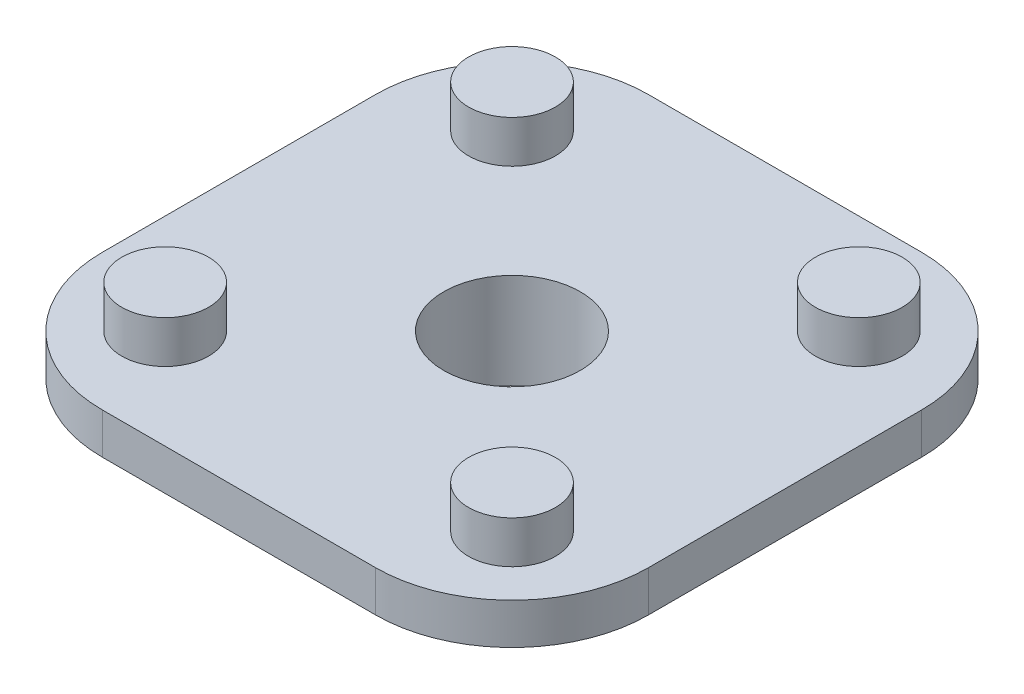
ISO-10303-21;
HEADER;
FILE_DESCRIPTION(('STEP AP214'),'2;1');
FILE_NAME('part.step','',(''),(''),'','','');
FILE_SCHEMA(('AUTOMOTIVE_DESIGN { 1 0 10303 214 1 1 1 1 }'));
ENDSEC;
DATA;
#1=APPLICATION_CONTEXT('core data for automotive mechanical design processes');
#2=APPLICATION_PROTOCOL_DEFINITION('international standard','automotive_design',2000,#1);
#3=PRODUCT_CONTEXT('',#1,'mechanical');
#4=PRODUCT('Part','Part','',(#3));
#5=PRODUCT_RELATED_PRODUCT_CATEGORY('part','',(#4));
#6=PRODUCT_DEFINITION_FORMATION('','',#4);
#7=PRODUCT_DEFINITION_CONTEXT('part definition',#1,'design');
#8=PRODUCT_DEFINITION('design','',#6,#7);
#9=PRODUCT_DEFINITION_SHAPE('','',#8);
#10=(LENGTH_UNIT() NAMED_UNIT(*) SI_UNIT(.MILLI.,.METRE.));
#11=(NAMED_UNIT(*) PLANE_ANGLE_UNIT() SI_UNIT($,.RADIAN.));
#12=(NAMED_UNIT(*) SI_UNIT($,.STERADIAN.) SOLID_ANGLE_UNIT());
#13=UNCERTAINTY_MEASURE_WITH_UNIT(LENGTH_MEASURE(1.E-05),#10,'distance_accuracy_value','');
#14=(GEOMETRIC_REPRESENTATION_CONTEXT(3) GLOBAL_UNCERTAINTY_ASSIGNED_CONTEXT((#13)) GLOBAL_UNIT_ASSIGNED_CONTEXT((#10,
#11,#12)) REPRESENTATION_CONTEXT('',''));
#15=CARTESIAN_POINT('',(0.,0.,0.));
#16=DIRECTION('',(0.,0.,1.));
#17=DIRECTION('',(1.,0.,0.));
#18=AXIS2_PLACEMENT_3D('',#15,#16,#17);
#19=CARTESIAN_POINT('',(-10.,0.,10.));
#20=DIRECTION('',(0.,1.,0.));
#21=DIRECTION('',(0.,0.,1.));
#22=AXIS2_PLACEMENT_3D('',#19,#20,#21);
#23=PLANE('',#22);
#24=CARTESIAN_POINT('',(-10.,0.,10.));
#25=DIRECTION('',(0.,1.,0.));
#26=DIRECTION('',(0.,0.,1.));
#27=AXIS2_PLACEMENT_3D('',#24,#25,#26);
#28=CIRCLE('',#27,10.);
#29=CARTESIAN_POINT('',(-20.,0.,9.99999999999993));
#30=VERTEX_POINT('',#29);
#31=CARTESIAN_POINT('',(-9.99999999999993,0.,20.));
#32=VERTEX_POINT('',#31);
#33=EDGE_CURVE('E146',#30,#32,#28,.T.);
#34=ORIENTED_EDGE('',*,*,#33,.F.);
#35=DIRECTION('',(0.,0.,1.));
#36=VECTOR('',#35,1.);
#37=CARTESIAN_POINT('',(-20.,0.,-9.99999999999993));
#38=LINE('',#37,#36);
#39=CARTESIAN_POINT('',(-20.,0.,-9.99999999999993));
#40=VERTEX_POINT('',#39);
#41=EDGE_CURVE('E96',#40,#30,#38,.T.);
#42=ORIENTED_EDGE('',*,*,#41,.F.);
#43=CARTESIAN_POINT('',(-10.,0.,-10.));
#44=DIRECTION('',(0.,1.,0.));
#45=DIRECTION('',(0.,0.,1.));
#46=AXIS2_PLACEMENT_3D('',#43,#44,#45);
#47=CIRCLE('',#46,10.);
#48=CARTESIAN_POINT('',(-9.99999999999993,0.,-20.));
#49=VERTEX_POINT('',#48);
#50=EDGE_CURVE('E90',#49,#40,#47,.T.);
#51=ORIENTED_EDGE('',*,*,#50,.F.);
#52=DIRECTION('',(-1.,0.,0.));
#53=VECTOR('',#52,1.);
#54=CARTESIAN_POINT('',(-9.99999999999993,0.,-20.));
#55=LINE('',#54,#53);
#56=CARTESIAN_POINT('',(9.99999999999993,0.,-20.));
#57=VERTEX_POINT('',#56);
#58=EDGE_CURVE('E133',#57,#49,#55,.T.);
#59=ORIENTED_EDGE('',*,*,#58,.F.);
#60=CARTESIAN_POINT('',(10.,0.,-10.));
#61=DIRECTION('',(0.,1.,0.));
#62=DIRECTION('',(0.,0.,-1.));
#63=AXIS2_PLACEMENT_3D('',#60,#61,#62);
#64=CIRCLE('',#63,10.);
#65=CARTESIAN_POINT('',(20.,0.,-9.99999999999993));
#66=VERTEX_POINT('',#65);
#67=EDGE_CURVE('E160',#66,#57,#64,.T.);
#68=ORIENTED_EDGE('',*,*,#67,.F.);
#69=DIRECTION('',(0.,0.,-1.));
#70=VECTOR('',#69,1.);
#71=CARTESIAN_POINT('',(20.,0.,-9.99999999999993));
#72=LINE('',#71,#70);
#73=CARTESIAN_POINT('',(20.,0.,9.99999999999993));
#74=VERTEX_POINT('',#73);
#75=EDGE_CURVE('E157',#74,#66,#72,.T.);
#76=ORIENTED_EDGE('',*,*,#75,.F.);
#77=CARTESIAN_POINT('',(10.,0.,10.));
#78=DIRECTION('',(0.,1.,0.));
#79=DIRECTION('',(0.,0.,1.));
#80=AXIS2_PLACEMENT_3D('',#77,#78,#79);
#81=CIRCLE('',#80,10.);
#82=CARTESIAN_POINT('',(9.99999999999993,0.,20.));
#83=VERTEX_POINT('',#82);
#84=EDGE_CURVE('E154',#83,#74,#81,.T.);
#85=ORIENTED_EDGE('',*,*,#84,.F.);
#86=DIRECTION('',(1.,0.,0.));
#87=VECTOR('',#86,1.);
#88=CARTESIAN_POINT('',(-9.99999999999993,0.,20.));
#89=LINE('',#88,#87);
#90=EDGE_CURVE('E150',#32,#83,#89,.T.);
#91=ORIENTED_EDGE('',*,*,#90,.F.);
#92=EDGE_LOOP('',(#34,#42,#51,#59,#68,#76,#85,#91));
#93=FACE_BOUND('',#92,.T.);
#94=CARTESIAN_POINT('',(0.,0.,0.));
#95=DIRECTION('',(0.,1.,0.));
#96=DIRECTION('',(0.,0.,1.));
#97=AXIS2_PLACEMENT_3D('',#94,#95,#96);
#98=CIRCLE('',#97,7.5);
#99=CARTESIAN_POINT('',(0.,0.,7.5));
#100=VERTEX_POINT('',#99);
#101=EDGE_CURVE('E11',#100,#100,#98,.F.);
#102=ORIENTED_EDGE('',*,*,#101,.F.);
#103=EDGE_LOOP('',(#102));
#104=FACE_BOUND('',#103,.T.);
#105=ADVANCED_FACE('F43',(#93,#104),#23,.F.);
#106=CARTESIAN_POINT('',(-10.,3.,10.));
#107=DIRECTION('',(0.,-1.,0.));
#108=DIRECTION('',(0.,0.,-1.));
#109=AXIS2_PLACEMENT_3D('',#106,#107,#108);
#110=CYLINDRICAL_SURFACE('',#109,10.);
#111=ORIENTED_EDGE('',*,*,#33,.T.);
#112=DIRECTION('',(0.,-1.,0.));
#113=VECTOR('',#112,1.);
#114=CARTESIAN_POINT('',(-9.99999999999993,3.,20.));
#115=LINE('',#114,#113);
#116=CARTESIAN_POINT('',(-9.99999999999993,3.,20.));
#117=VERTEX_POINT('',#116);
#118=EDGE_CURVE('E53',#117,#32,#115,.T.);
#119=ORIENTED_EDGE('',*,*,#118,.F.);
#120=CARTESIAN_POINT('',(-10.,3.,10.));
#121=DIRECTION('',(0.,1.,0.));
#122=DIRECTION('',(0.,0.,1.));
#123=AXIS2_PLACEMENT_3D('',#120,#121,#122);
#124=CIRCLE('',#123,10.);
#125=CARTESIAN_POINT('',(-20.,3.,9.99999999999993));
#126=VERTEX_POINT('',#125);
#127=EDGE_CURVE('E169',#126,#117,#124,.T.);
#128=ORIENTED_EDGE('',*,*,#127,.F.);
#129=DIRECTION('',(0.,-1.,0.));
#130=VECTOR('',#129,1.);
#131=CARTESIAN_POINT('',(-20.,3.,9.99999999999993));
#132=LINE('',#131,#130);
#133=EDGE_CURVE('E142',#126,#30,#132,.T.);
#134=ORIENTED_EDGE('',*,*,#133,.T.);
#135=EDGE_LOOP('',(#111,#119,#128,#134));
#136=FACE_BOUND('',#135,.T.);
#137=ADVANCED_FACE('F45',(#136),#110,.T.);
#138=CARTESIAN_POINT('',(-9.99999999999993,3.,20.));
#139=DIRECTION('',(0.,0.,-1.));
#140=DIRECTION('',(-1.,0.,0.));
#141=AXIS2_PLACEMENT_3D('',#138,#139,#140);
#142=PLANE('',#141);
#143=ORIENTED_EDGE('',*,*,#90,.T.);
#144=DIRECTION('',(0.,-1.,0.));
#145=VECTOR('',#144,1.);
#146=CARTESIAN_POINT('',(9.99999999999993,3.,20.));
#147=LINE('',#146,#145);
#148=CARTESIAN_POINT('',(9.99999999999993,3.,20.));
#149=VERTEX_POINT('',#148);
#150=EDGE_CURVE('E184',#149,#83,#147,.T.);
#151=ORIENTED_EDGE('',*,*,#150,.F.);
#152=DIRECTION('',(1.,0.,0.));
#153=VECTOR('',#152,1.);
#154=CARTESIAN_POINT('',(-9.99999999999993,3.,20.));
#155=LINE('',#154,#153);
#156=EDGE_CURVE('E105',#117,#149,#155,.T.);
#157=ORIENTED_EDGE('',*,*,#156,.F.);
#158=ORIENTED_EDGE('',*,*,#118,.T.);
#159=EDGE_LOOP('',(#143,#151,#157,#158));
#160=FACE_BOUND('',#159,.T.);
#161=ADVANCED_FACE('F189',(#160),#142,.F.);
#162=CARTESIAN_POINT('',(10.,3.,10.));
#163=DIRECTION('',(0.,-1.,0.));
#164=DIRECTION('',(0.,0.,-1.));
#165=AXIS2_PLACEMENT_3D('',#162,#163,#164);
#166=CYLINDRICAL_SURFACE('',#165,10.);
#167=ORIENTED_EDGE('',*,*,#84,.T.);
#168=DIRECTION('',(0.,-1.,0.));
#169=VECTOR('',#168,1.);
#170=CARTESIAN_POINT('',(20.,3.,9.99999999999993));
#171=LINE('',#170,#169);
#172=CARTESIAN_POINT('',(20.,3.,9.99999999999993));
#173=VERTEX_POINT('',#172);
#174=EDGE_CURVE('E180',#173,#74,#171,.T.);
#175=ORIENTED_EDGE('',*,*,#174,.F.);
#176=CARTESIAN_POINT('',(10.,3.,10.));
#177=DIRECTION('',(0.,1.,0.));
#178=DIRECTION('',(0.,0.,1.));
#179=AXIS2_PLACEMENT_3D('',#176,#177,#178);
#180=CIRCLE('',#179,10.);
#181=EDGE_CURVE('E208',#149,#173,#180,.T.);
#182=ORIENTED_EDGE('',*,*,#181,.F.);
#183=ORIENTED_EDGE('',*,*,#150,.T.);
#184=EDGE_LOOP('',(#167,#175,#182,#183));
#185=FACE_BOUND('',#184,.T.);
#186=ADVANCED_FACE('F200',(#185),#166,.T.);
#187=CARTESIAN_POINT('',(20.,3.,-9.99999999999993));
#188=DIRECTION('',(-1.,0.,0.));
#189=DIRECTION('',(0.,0.,1.));
#190=AXIS2_PLACEMENT_3D('',#187,#188,#189);
#191=PLANE('',#190);
#192=ORIENTED_EDGE('',*,*,#75,.T.);
#193=DIRECTION('',(0.,-1.,0.));
#194=VECTOR('',#193,1.);
#195=CARTESIAN_POINT('',(20.,3.,-9.99999999999993));
#196=LINE('',#195,#194);
#197=CARTESIAN_POINT('',(20.,3.,-9.99999999999993));
#198=VERTEX_POINT('',#197);
#199=EDGE_CURVE('E176',#198,#66,#196,.T.);
#200=ORIENTED_EDGE('',*,*,#199,.F.);
#201=DIRECTION('',(0.,0.,-1.));
#202=VECTOR('',#201,1.);
#203=CARTESIAN_POINT('',(20.,3.,-9.99999999999993));
#204=LINE('',#203,#202);
#205=EDGE_CURVE('E206',#173,#198,#204,.T.);
#206=ORIENTED_EDGE('',*,*,#205,.F.);
#207=ORIENTED_EDGE('',*,*,#174,.T.);
#208=EDGE_LOOP('',(#192,#200,#206,#207));
#209=FACE_BOUND('',#208,.T.);
#210=ADVANCED_FACE('F204',(#209),#191,.F.);
#211=CARTESIAN_POINT('',(10.,3.,-10.));
#212=DIRECTION('',(0.,-1.,0.));
#213=DIRECTION('',(0.,0.,-1.));
#214=AXIS2_PLACEMENT_3D('',#211,#212,#213);
#215=CYLINDRICAL_SURFACE('',#214,10.);
#216=ORIENTED_EDGE('',*,*,#67,.T.);
#217=DIRECTION('',(0.,-1.,0.));
#218=VECTOR('',#217,1.);
#219=CARTESIAN_POINT('',(9.99999999999993,3.,-20.));
#220=LINE('',#219,#218);
#221=CARTESIAN_POINT('',(9.99999999999993,3.,-20.));
#222=VERTEX_POINT('',#221);
#223=EDGE_CURVE('E135',#222,#57,#220,.T.);
#224=ORIENTED_EDGE('',*,*,#223,.F.);
#225=CARTESIAN_POINT('',(10.,3.,-10.));
#226=DIRECTION('',(0.,1.,0.));
#227=DIRECTION('',(0.,0.,-1.));
#228=AXIS2_PLACEMENT_3D('',#225,#226,#227);
#229=CIRCLE('',#228,10.);
#230=EDGE_CURVE('E124',#198,#222,#229,.T.);
#231=ORIENTED_EDGE('',*,*,#230,.F.);
#232=ORIENTED_EDGE('',*,*,#199,.T.);
#233=EDGE_LOOP('',(#216,#224,#231,#232));
#234=FACE_BOUND('',#233,.T.);
#235=ADVANCED_FACE('F293',(#234),#215,.T.);
#236=CARTESIAN_POINT('',(-9.99999999999993,3.,-20.));
#237=DIRECTION('',(0.,0.,1.));
#238=DIRECTION('',(1.,0.,0.));
#239=AXIS2_PLACEMENT_3D('',#236,#237,#238);
#240=PLANE('',#239);
#241=ORIENTED_EDGE('',*,*,#58,.T.);
#242=DIRECTION('',(0.,-1.,0.));
#243=VECTOR('',#242,1.);
#244=CARTESIAN_POINT('',(-9.99999999999993,3.,-20.));
#245=LINE('',#244,#243);
#246=CARTESIAN_POINT('',(-9.99999999999993,3.,-20.));
#247=VERTEX_POINT('',#246);
#248=EDGE_CURVE('E130',#247,#49,#245,.T.);
#249=ORIENTED_EDGE('',*,*,#248,.F.);
#250=DIRECTION('',(-1.,0.,0.));
#251=VECTOR('',#250,1.);
#252=CARTESIAN_POINT('',(-9.99999999999993,3.,-20.));
#253=LINE('',#252,#251);
#254=EDGE_CURVE('E118',#222,#247,#253,.T.);
#255=ORIENTED_EDGE('',*,*,#254,.F.);
#256=ORIENTED_EDGE('',*,*,#223,.T.);
#257=EDGE_LOOP('',(#241,#249,#255,#256));
#258=FACE_BOUND('',#257,.T.);
#259=ADVANCED_FACE('F131',(#258),#240,.F.);
#260=CARTESIAN_POINT('',(-10.,3.,-10.));
#261=DIRECTION('',(0.,-1.,0.));
#262=DIRECTION('',(0.,0.,-1.));
#263=AXIS2_PLACEMENT_3D('',#260,#261,#262);
#264=CYLINDRICAL_SURFACE('',#263,10.);
#265=ORIENTED_EDGE('',*,*,#50,.T.);
#266=DIRECTION('',(0.,-1.,0.));
#267=VECTOR('',#266,1.);
#268=CARTESIAN_POINT('',(-20.,3.,-9.99999999999993));
#269=LINE('',#268,#267);
#270=CARTESIAN_POINT('',(-20.,3.,-9.99999999999993));
#271=VERTEX_POINT('',#270);
#272=EDGE_CURVE('E136',#271,#40,#269,.T.);
#273=ORIENTED_EDGE('',*,*,#272,.F.);
#274=CARTESIAN_POINT('',(-10.,3.,-10.));
#275=DIRECTION('',(0.,1.,0.));
#276=DIRECTION('',(0.,0.,1.));
#277=AXIS2_PLACEMENT_3D('',#274,#275,#276);
#278=CIRCLE('',#277,10.);
#279=EDGE_CURVE('E122',#247,#271,#278,.T.);
#280=ORIENTED_EDGE('',*,*,#279,.F.);
#281=ORIENTED_EDGE('',*,*,#248,.T.);
#282=EDGE_LOOP('',(#265,#273,#280,#281));
#283=FACE_BOUND('',#282,.T.);
#284=ADVANCED_FACE('F138',(#283),#264,.T.);
#285=CARTESIAN_POINT('',(-20.,3.,-9.99999999999993));
#286=DIRECTION('',(1.,0.,0.));
#287=DIRECTION('',(0.,0.,-1.));
#288=AXIS2_PLACEMENT_3D('',#285,#286,#287);
#289=PLANE('',#288);
#290=ORIENTED_EDGE('',*,*,#41,.T.);
#291=ORIENTED_EDGE('',*,*,#133,.F.);
#292=DIRECTION('',(0.,0.,1.));
#293=VECTOR('',#292,1.);
#294=CARTESIAN_POINT('',(-20.,3.,-9.99999999999993));
#295=LINE('',#294,#293);
#296=EDGE_CURVE('E61',#271,#126,#295,.T.);
#297=ORIENTED_EDGE('',*,*,#296,.F.);
#298=ORIENTED_EDGE('',*,*,#272,.T.);
#299=EDGE_LOOP('',(#290,#291,#297,#298));
#300=FACE_BOUND('',#299,.T.);
#301=ADVANCED_FACE('F286',(#300),#289,.F.);
#302=CARTESIAN_POINT('',(-10.,3.,10.));
#303=DIRECTION('',(0.,1.,0.));
#304=DIRECTION('',(0.,0.,1.));
#305=AXIS2_PLACEMENT_3D('',#302,#303,#304);
#306=PLANE('',#305);
#307=CARTESIAN_POINT('',(0.,3.,0.));
#308=DIRECTION('',(0.,1.,0.));
#309=DIRECTION('',(0.,0.,1.));
#310=AXIS2_PLACEMENT_3D('',#307,#308,#309);
#311=CIRCLE('',#310,5.);
#312=CARTESIAN_POINT('',(0.,3.,5.));
#313=VERTEX_POINT('',#312);
#314=EDGE_CURVE('E246',#313,#313,#311,.T.);
#315=ORIENTED_EDGE('',*,*,#314,.F.);
#316=EDGE_LOOP('',(#315));
#317=FACE_BOUND('',#316,.T.);
#318=CARTESIAN_POINT('',(-12.7,3.,-12.7));
#319=DIRECTION('',(0.,1.,0.));
#320=DIRECTION('',(0.,0.,-1.));
#321=AXIS2_PLACEMENT_3D('',#318,#319,#320);
#322=CIRCLE('',#321,3.18);
#323=CARTESIAN_POINT('',(-12.7,3.,-15.88));
#324=VERTEX_POINT('',#323);
#325=EDGE_CURVE('E238',#324,#324,#322,.T.);
#326=ORIENTED_EDGE('',*,*,#325,.F.);
#327=EDGE_LOOP('',(#326));
#328=FACE_BOUND('',#327,.T.);
#329=CARTESIAN_POINT('',(-12.7,3.,12.7));
#330=DIRECTION('',(0.,1.,0.));
#331=DIRECTION('',(0.,0.,1.));
#332=AXIS2_PLACEMENT_3D('',#329,#330,#331);
#333=CIRCLE('',#332,3.18);
#334=CARTESIAN_POINT('',(-12.7,3.,9.52));
#335=VERTEX_POINT('',#334);
#336=EDGE_CURVE('E230',#335,#335,#333,.T.);
#337=ORIENTED_EDGE('',*,*,#336,.F.);
#338=EDGE_LOOP('',(#337));
#339=FACE_BOUND('',#338,.T.);
#340=CARTESIAN_POINT('',(12.7,3.,12.7));
#341=DIRECTION('',(0.,1.,0.));
#342=DIRECTION('',(0.,0.,-1.));
#343=AXIS2_PLACEMENT_3D('',#340,#341,#342);
#344=CIRCLE('',#343,3.18);
#345=CARTESIAN_POINT('',(12.7,3.,9.52));
#346=VERTEX_POINT('',#345);
#347=EDGE_CURVE('E222',#346,#346,#344,.T.);
#348=ORIENTED_EDGE('',*,*,#347,.F.);
#349=EDGE_LOOP('',(#348));
#350=FACE_BOUND('',#349,.T.);
#351=CARTESIAN_POINT('',(12.7,3.,-12.7));
#352=DIRECTION('',(0.,1.,0.));
#353=DIRECTION('',(0.,0.,1.));
#354=AXIS2_PLACEMENT_3D('',#351,#352,#353);
#355=CIRCLE('',#354,3.18);
#356=CARTESIAN_POINT('',(12.7,3.,-15.88));
#357=VERTEX_POINT('',#356);
#358=EDGE_CURVE('E218',#357,#357,#355,.T.);
#359=ORIENTED_EDGE('',*,*,#358,.F.);
#360=EDGE_LOOP('',(#359));
#361=FACE_BOUND('',#360,.T.);
#362=ORIENTED_EDGE('',*,*,#127,.T.);
#363=ORIENTED_EDGE('',*,*,#156,.T.);
#364=ORIENTED_EDGE('',*,*,#181,.T.);
#365=ORIENTED_EDGE('',*,*,#205,.T.);
#366=ORIENTED_EDGE('',*,*,#230,.T.);
#367=ORIENTED_EDGE('',*,*,#254,.T.);
#368=ORIENTED_EDGE('',*,*,#279,.T.);
#369=ORIENTED_EDGE('',*,*,#296,.T.);
#370=EDGE_LOOP('',(#362,#363,#364,#365,#366,#367,#368,#369));
#371=FACE_BOUND('',#370,.T.);
#372=ADVANCED_FACE('F120',(#317,#328,#339,#350,#361,#371),#306,.T.);
#373=CARTESIAN_POINT('',(12.7,6.1,-12.7));
#374=DIRECTION('',(0.,-1.,0.));
#375=DIRECTION('',(0.,0.,-1.));
#376=AXIS2_PLACEMENT_3D('',#373,#374,#375);
#377=CYLINDRICAL_SURFACE('',#376,3.18);
#378=CARTESIAN_POINT('',(12.7,6.1,-12.7));
#379=DIRECTION('',(0.,1.,0.));
#380=DIRECTION('',(0.,0.,1.));
#381=AXIS2_PLACEMENT_3D('',#378,#379,#380);
#382=CIRCLE('',#381,3.18);
#383=CARTESIAN_POINT('',(12.7,6.1,-15.88));
#384=VERTEX_POINT('',#383);
#385=EDGE_CURVE('E151',#384,#384,#382,.T.);
#386=CARTESIAN_POINT('',(12.7,6.1,-15.88));
#387=CARTESIAN_POINT('',(12.7,6.06770833333333,-15.88));
#388=CARTESIAN_POINT('',(12.7,6.03541666666667,-15.88));
#389=CARTESIAN_POINT('',(12.7,5.97083333333333,-15.88));
#390=CARTESIAN_POINT('',(12.7,5.93854166666667,-15.88));
#391=CARTESIAN_POINT('',(12.7,5.87395833333333,-15.88));
#392=CARTESIAN_POINT('',(12.7,5.84166666666667,-15.88));
#393=CARTESIAN_POINT('',(12.7,5.77708333333333,-15.88));
#394=CARTESIAN_POINT('',(12.7,5.74479166666667,-15.88));
#395=CARTESIAN_POINT('',(12.7,5.68020833333333,-15.88));
#396=CARTESIAN_POINT('',(12.7,5.64791666666667,-15.88));
#397=CARTESIAN_POINT('',(12.7,5.58333333333333,-15.88));
#398=CARTESIAN_POINT('',(12.7,5.55104166666667,-15.88));
#399=CARTESIAN_POINT('',(12.7,5.48645833333333,-15.88));
#400=CARTESIAN_POINT('',(12.7,5.45416666666667,-15.88));
#401=CARTESIAN_POINT('',(12.7,5.38958333333333,-15.88));
#402=CARTESIAN_POINT('',(12.7,5.35729166666667,-15.88));
#403=CARTESIAN_POINT('',(12.7,5.29270833333333,-15.88));
#404=CARTESIAN_POINT('',(12.7,5.26041666666667,-15.88));
#405=CARTESIAN_POINT('',(12.7,5.19583333333333,-15.88));
#406=CARTESIAN_POINT('',(12.7,5.16354166666667,-15.88));
#407=CARTESIAN_POINT('',(12.7,5.09895833333333,-15.88));
#408=CARTESIAN_POINT('',(12.7,5.06666666666667,-15.88));
#409=CARTESIAN_POINT('',(12.7,5.00208333333333,-15.88));
#410=CARTESIAN_POINT('',(12.7,4.96979166666667,-15.88));
#411=CARTESIAN_POINT('',(12.7,4.90520833333333,-15.88));
#412=CARTESIAN_POINT('',(12.7,4.87291666666667,-15.88));
#413=CARTESIAN_POINT('',(12.7,4.80833333333333,-15.88));
#414=CARTESIAN_POINT('',(12.7,4.77604166666667,-15.88));
#415=CARTESIAN_POINT('',(12.7,4.71145833333333,-15.88));
#416=CARTESIAN_POINT('',(12.7,4.67916666666667,-15.88));
#417=CARTESIAN_POINT('',(12.7,4.61458333333333,-15.88));
#418=CARTESIAN_POINT('',(12.7,4.58229166666667,-15.88));
#419=CARTESIAN_POINT('',(12.7,4.51770833333333,-15.88));
#420=CARTESIAN_POINT('',(12.7,4.48541666666667,-15.88));
#421=CARTESIAN_POINT('',(12.7,4.42083333333333,-15.88));
#422=CARTESIAN_POINT('',(12.7,4.38854166666667,-15.88));
#423=CARTESIAN_POINT('',(12.7,4.32395833333333,-15.88));
#424=CARTESIAN_POINT('',(12.7,4.29166666666667,-15.88));
#425=CARTESIAN_POINT('',(12.7,4.22708333333333,-15.88));
#426=CARTESIAN_POINT('',(12.7,4.19479166666667,-15.88));
#427=CARTESIAN_POINT('',(12.7,4.13020833333333,-15.88));
#428=CARTESIAN_POINT('',(12.7,4.09791666666667,-15.88));
#429=CARTESIAN_POINT('',(12.7,4.03333333333333,-15.88));
#430=CARTESIAN_POINT('',(12.7,4.00104166666667,-15.88));
#431=CARTESIAN_POINT('',(12.7,3.93645833333333,-15.88));
#432=CARTESIAN_POINT('',(12.7,3.90416666666667,-15.88));
#433=CARTESIAN_POINT('',(12.7,3.83958333333333,-15.88));
#434=CARTESIAN_POINT('',(12.7,3.80729166666667,-15.88));
#435=CARTESIAN_POINT('',(12.7,3.74270833333333,-15.88));
#436=CARTESIAN_POINT('',(12.7,3.71041666666667,-15.88));
#437=CARTESIAN_POINT('',(12.7,3.64583333333333,-15.88));
#438=CARTESIAN_POINT('',(12.7,3.61354166666667,-15.88));
#439=CARTESIAN_POINT('',(12.7,3.54895833333333,-15.88));
#440=CARTESIAN_POINT('',(12.7,3.51666666666667,-15.88));
#441=CARTESIAN_POINT('',(12.7,3.45208333333333,-15.88));
#442=CARTESIAN_POINT('',(12.7,3.41979166666667,-15.88));
#443=CARTESIAN_POINT('',(12.7,3.35520833333333,-15.88));
#444=CARTESIAN_POINT('',(12.7,3.32291666666667,-15.88));
#445=CARTESIAN_POINT('',(12.7,3.25833333333333,-15.88));
#446=CARTESIAN_POINT('',(12.7,3.22604166666667,-15.88));
#447=CARTESIAN_POINT('',(12.7,3.16145833333333,-15.88));
#448=CARTESIAN_POINT('',(12.7,3.12916666666667,-15.88));
#449=CARTESIAN_POINT('',(12.7,3.06458333333333,-15.88));
#450=CARTESIAN_POINT('',(12.7,3.03229166666667,-15.88));
#451=CARTESIAN_POINT('',(12.7,3.,-15.88));
#452=B_SPLINE_CURVE_WITH_KNOTS('',3,(#386,#387,#388,#389,#390,#391,#392,#393,#394,#395,#396,
#397,#398,#399,#400,#401,#402,#403,#404,#405,#406,#407,#408,#409,#410,#411,#412,#413,#414,#415,
#416,#417,#418,#419,#420,#421,#422,#423,#424,#425,#426,#427,#428,#429,#430,#431,#432,#433,#434,
#435,#436,#437,#438,#439,#440,#441,#442,#443,#444,#445,#446,#447,#448,#449,#450,#451),
.UNSPECIFIED.,.F.,.F.,(4,2,2,2,2,2,2,2,2,2,2,2,2,2,2,2,2,2,2,2,2,2,2,2,2,2,2,2,2,2,2,2,4),(0.,
0.0968750000000006,0.19375,0.290625,0.387500000000001,0.484375,0.58125,0.678125,0.775,0.871875,
0.96875,1.065625,1.1625,1.259375,1.35625,1.453125,1.55,1.646875,1.74375,1.840625,1.9375,
2.034375,2.13125,2.228125,2.325,2.421875,2.51875,2.615625,2.7125,2.809375,2.90625,3.003125,3.1),.UNSPECIFIED.);
#453=EDGE_CURVE('BSEAM336',#384,#357,#452,.T.);
#454=ORIENTED_EDGE('',*,*,#385,.F.);
#455=ORIENTED_EDGE('',*,*,#358,.T.);
#456=ORIENTED_EDGE('',*,*,#453,.T.);
#457=ORIENTED_EDGE('',*,*,#453,.F.);
#458=EDGE_LOOP('',(#454,#456,#455,#457));
#459=FACE_BOUND('',#458,.T.);
#460=ADVANCED_FACE('F336',(#459),#377,.T.);
#461=CARTESIAN_POINT('',(12.7,6.1,-12.7));
#462=DIRECTION('',(0.,1.,0.));
#463=DIRECTION('',(0.,0.,1.));
#464=AXIS2_PLACEMENT_3D('',#461,#462,#463);
#465=PLANE('',#464);
#466=ORIENTED_EDGE('',*,*,#385,.T.);
#467=EDGE_LOOP('',(#466));
#468=FACE_BOUND('',#467,.T.);
#469=ADVANCED_FACE('F343',(#468),#465,.T.);
#470=CARTESIAN_POINT('',(12.7,6.1,12.7));
#471=DIRECTION('',(0.,-1.,0.));
#472=DIRECTION('',(0.,0.,-1.));
#473=AXIS2_PLACEMENT_3D('',#470,#471,#472);
#474=CYLINDRICAL_SURFACE('',#473,3.18);
#475=CARTESIAN_POINT('',(12.7,6.1,12.7));
#476=DIRECTION('',(0.,1.,0.));
#477=DIRECTION('',(0.,0.,-1.));
#478=AXIS2_PLACEMENT_3D('',#475,#476,#477);
#479=CIRCLE('',#478,3.18);
#480=CARTESIAN_POINT('',(12.7,6.1,9.52));
#481=VERTEX_POINT('',#480);
#482=EDGE_CURVE('E226',#481,#481,#479,.T.);
#483=CARTESIAN_POINT('',(12.7,6.1,9.52));
#484=CARTESIAN_POINT('',(12.7,6.06770833333333,9.52));
#485=CARTESIAN_POINT('',(12.7,6.03541666666667,9.52));
#486=CARTESIAN_POINT('',(12.7,5.97083333333333,9.52));
#487=CARTESIAN_POINT('',(12.7,5.93854166666667,9.52));
#488=CARTESIAN_POINT('',(12.7,5.87395833333333,9.52));
#489=CARTESIAN_POINT('',(12.7,5.84166666666667,9.52));
#490=CARTESIAN_POINT('',(12.7,5.77708333333333,9.52));
#491=CARTESIAN_POINT('',(12.7,5.74479166666667,9.52));
#492=CARTESIAN_POINT('',(12.7,5.68020833333333,9.52));
#493=CARTESIAN_POINT('',(12.7,5.64791666666667,9.52));
#494=CARTESIAN_POINT('',(12.7,5.58333333333333,9.52));
#495=CARTESIAN_POINT('',(12.7,5.55104166666667,9.52));
#496=CARTESIAN_POINT('',(12.7,5.48645833333333,9.52));
#497=CARTESIAN_POINT('',(12.7,5.45416666666667,9.52));
#498=CARTESIAN_POINT('',(12.7,5.38958333333333,9.52));
#499=CARTESIAN_POINT('',(12.7,5.35729166666667,9.52));
#500=CARTESIAN_POINT('',(12.7,5.29270833333333,9.52));
#501=CARTESIAN_POINT('',(12.7,5.26041666666667,9.52));
#502=CARTESIAN_POINT('',(12.7,5.19583333333333,9.52));
#503=CARTESIAN_POINT('',(12.7,5.16354166666667,9.52));
#504=CARTESIAN_POINT('',(12.7,5.09895833333333,9.52));
#505=CARTESIAN_POINT('',(12.7,5.06666666666667,9.52));
#506=CARTESIAN_POINT('',(12.7,5.00208333333333,9.52));
#507=CARTESIAN_POINT('',(12.7,4.96979166666667,9.52));
#508=CARTESIAN_POINT('',(12.7,4.90520833333333,9.52));
#509=CARTESIAN_POINT('',(12.7,4.87291666666667,9.52));
#510=CARTESIAN_POINT('',(12.7,4.80833333333333,9.52));
#511=CARTESIAN_POINT('',(12.7,4.77604166666667,9.52));
#512=CARTESIAN_POINT('',(12.7,4.71145833333333,9.52));
#513=CARTESIAN_POINT('',(12.7,4.67916666666667,9.52));
#514=CARTESIAN_POINT('',(12.7,4.61458333333333,9.52));
#515=CARTESIAN_POINT('',(12.7,4.58229166666667,9.52));
#516=CARTESIAN_POINT('',(12.7,4.51770833333333,9.52));
#517=CARTESIAN_POINT('',(12.7,4.48541666666667,9.52));
#518=CARTESIAN_POINT('',(12.7,4.42083333333333,9.52));
#519=CARTESIAN_POINT('',(12.7,4.38854166666667,9.52));
#520=CARTESIAN_POINT('',(12.7,4.32395833333333,9.52));
#521=CARTESIAN_POINT('',(12.7,4.29166666666667,9.52));
#522=CARTESIAN_POINT('',(12.7,4.22708333333333,9.52));
#523=CARTESIAN_POINT('',(12.7,4.19479166666667,9.52));
#524=CARTESIAN_POINT('',(12.7,4.13020833333333,9.52));
#525=CARTESIAN_POINT('',(12.7,4.09791666666667,9.52));
#526=CARTESIAN_POINT('',(12.7,4.03333333333333,9.52));
#527=CARTESIAN_POINT('',(12.7,4.00104166666667,9.52));
#528=CARTESIAN_POINT('',(12.7,3.93645833333333,9.52));
#529=CARTESIAN_POINT('',(12.7,3.90416666666667,9.52));
#530=CARTESIAN_POINT('',(12.7,3.83958333333333,9.52));
#531=CARTESIAN_POINT('',(12.7,3.80729166666667,9.52));
#532=CARTESIAN_POINT('',(12.7,3.74270833333333,9.52));
#533=CARTESIAN_POINT('',(12.7,3.71041666666667,9.52));
#534=CARTESIAN_POINT('',(12.7,3.64583333333333,9.52));
#535=CARTESIAN_POINT('',(12.7,3.61354166666667,9.52));
#536=CARTESIAN_POINT('',(12.7,3.54895833333333,9.52));
#537=CARTESIAN_POINT('',(12.7,3.51666666666667,9.52));
#538=CARTESIAN_POINT('',(12.7,3.45208333333333,9.52));
#539=CARTESIAN_POINT('',(12.7,3.41979166666667,9.52));
#540=CARTESIAN_POINT('',(12.7,3.35520833333333,9.52));
#541=CARTESIAN_POINT('',(12.7,3.32291666666667,9.52));
#542=CARTESIAN_POINT('',(12.7,3.25833333333333,9.52));
#543=CARTESIAN_POINT('',(12.7,3.22604166666667,9.52));
#544=CARTESIAN_POINT('',(12.7,3.16145833333333,9.52));
#545=CARTESIAN_POINT('',(12.7,3.12916666666667,9.52));
#546=CARTESIAN_POINT('',(12.7,3.06458333333333,9.52));
#547=CARTESIAN_POINT('',(12.7,3.03229166666667,9.52));
#548=CARTESIAN_POINT('',(12.7,3.,9.52));
#549=B_SPLINE_CURVE_WITH_KNOTS('',3,(#483,#484,#485,#486,#487,#488,#489,#490,#491,#492,#493,
#494,#495,#496,#497,#498,#499,#500,#501,#502,#503,#504,#505,#506,#507,#508,#509,#510,#511,#512,
#513,#514,#515,#516,#517,#518,#519,#520,#521,#522,#523,#524,#525,#526,#527,#528,#529,#530,#531,
#532,#533,#534,#535,#536,#537,#538,#539,#540,#541,#542,#543,#544,#545,#546,#547,#548),
.UNSPECIFIED.,.F.,.F.,(4,2,2,2,2,2,2,2,2,2,2,2,2,2,2,2,2,2,2,2,2,2,2,2,2,2,2,2,2,2,2,2,4),(0.,
0.0968750000000006,0.19375,0.290625,0.387500000000001,0.484375,0.58125,0.678125,0.775,0.871875,
0.96875,1.065625,1.1625,1.259375,1.35625,1.453125,1.55,1.646875,1.74375,1.840625,1.9375,
2.034375,2.13125,2.228125,2.325,2.421875,2.51875,2.615625,2.7125,2.809375,2.90625,3.003125,3.1),.UNSPECIFIED.);
#550=EDGE_CURVE('BSEAM350',#481,#346,#549,.T.);
#551=ORIENTED_EDGE('',*,*,#482,.F.);
#552=ORIENTED_EDGE('',*,*,#347,.T.);
#553=ORIENTED_EDGE('',*,*,#550,.T.);
#554=ORIENTED_EDGE('',*,*,#550,.F.);
#555=EDGE_LOOP('',(#551,#553,#552,#554));
#556=FACE_BOUND('',#555,.T.);
#557=ADVANCED_FACE('F350',(#556),#474,.T.);
#558=CARTESIAN_POINT('',(12.7,6.1,12.7));
#559=DIRECTION('',(0.,-1.,0.));
#560=DIRECTION('',(0.,0.,-1.));
#561=AXIS2_PLACEMENT_3D('',#558,#559,#560);
#562=PLANE('',#561);
#563=ORIENTED_EDGE('',*,*,#482,.T.);
#564=EDGE_LOOP('',(#563));
#565=FACE_BOUND('',#564,.T.);
#566=ADVANCED_FACE('F358',(#565),#562,.F.);
#567=CARTESIAN_POINT('',(-12.7,6.1,12.7));
#568=DIRECTION('',(0.,-1.,0.));
#569=DIRECTION('',(0.,0.,-1.));
#570=AXIS2_PLACEMENT_3D('',#567,#568,#569);
#571=CYLINDRICAL_SURFACE('',#570,3.18);
#572=CARTESIAN_POINT('',(-12.7,6.1,12.7));
#573=DIRECTION('',(0.,1.,0.));
#574=DIRECTION('',(0.,0.,1.));
#575=AXIS2_PLACEMENT_3D('',#572,#573,#574);
#576=CIRCLE('',#575,3.18);
#577=CARTESIAN_POINT('',(-12.7,6.1,9.52));
#578=VERTEX_POINT('',#577);
#579=EDGE_CURVE('E234',#578,#578,#576,.T.);
#580=CARTESIAN_POINT('',(-12.7,6.1,9.52));
#581=CARTESIAN_POINT('',(-12.7,6.06770833333333,9.52));
#582=CARTESIAN_POINT('',(-12.7,6.03541666666667,9.52));
#583=CARTESIAN_POINT('',(-12.7,5.97083333333333,9.52));
#584=CARTESIAN_POINT('',(-12.7,5.93854166666667,9.52));
#585=CARTESIAN_POINT('',(-12.7,5.87395833333333,9.52));
#586=CARTESIAN_POINT('',(-12.7,5.84166666666667,9.52));
#587=CARTESIAN_POINT('',(-12.7,5.77708333333333,9.52));
#588=CARTESIAN_POINT('',(-12.7,5.74479166666667,9.52));
#589=CARTESIAN_POINT('',(-12.7,5.68020833333333,9.52));
#590=CARTESIAN_POINT('',(-12.7,5.64791666666667,9.52));
#591=CARTESIAN_POINT('',(-12.7,5.58333333333333,9.52));
#592=CARTESIAN_POINT('',(-12.7,5.55104166666667,9.52));
#593=CARTESIAN_POINT('',(-12.7,5.48645833333333,9.52));
#594=CARTESIAN_POINT('',(-12.7,5.45416666666667,9.52));
#595=CARTESIAN_POINT('',(-12.7,5.38958333333333,9.52));
#596=CARTESIAN_POINT('',(-12.7,5.35729166666667,9.52));
#597=CARTESIAN_POINT('',(-12.7,5.29270833333333,9.52));
#598=CARTESIAN_POINT('',(-12.7,5.26041666666667,9.52));
#599=CARTESIAN_POINT('',(-12.7,5.19583333333333,9.52));
#600=CARTESIAN_POINT('',(-12.7,5.16354166666667,9.52));
#601=CARTESIAN_POINT('',(-12.7,5.09895833333333,9.52));
#602=CARTESIAN_POINT('',(-12.7,5.06666666666667,9.52));
#603=CARTESIAN_POINT('',(-12.7,5.00208333333333,9.52));
#604=CARTESIAN_POINT('',(-12.7,4.96979166666667,9.52));
#605=CARTESIAN_POINT('',(-12.7,4.90520833333333,9.52));
#606=CARTESIAN_POINT('',(-12.7,4.87291666666667,9.52));
#607=CARTESIAN_POINT('',(-12.7,4.80833333333333,9.52));
#608=CARTESIAN_POINT('',(-12.7,4.77604166666667,9.52));
#609=CARTESIAN_POINT('',(-12.7,4.71145833333333,9.52));
#610=CARTESIAN_POINT('',(-12.7,4.67916666666667,9.52));
#611=CARTESIAN_POINT('',(-12.7,4.61458333333333,9.52));
#612=CARTESIAN_POINT('',(-12.7,4.58229166666667,9.52));
#613=CARTESIAN_POINT('',(-12.7,4.51770833333333,9.52));
#614=CARTESIAN_POINT('',(-12.7,4.48541666666667,9.52));
#615=CARTESIAN_POINT('',(-12.7,4.42083333333333,9.52));
#616=CARTESIAN_POINT('',(-12.7,4.38854166666667,9.52));
#617=CARTESIAN_POINT('',(-12.7,4.32395833333333,9.52));
#618=CARTESIAN_POINT('',(-12.7,4.29166666666667,9.52));
#619=CARTESIAN_POINT('',(-12.7,4.22708333333333,9.52));
#620=CARTESIAN_POINT('',(-12.7,4.19479166666667,9.52));
#621=CARTESIAN_POINT('',(-12.7,4.13020833333333,9.52));
#622=CARTESIAN_POINT('',(-12.7,4.09791666666667,9.52));
#623=CARTESIAN_POINT('',(-12.7,4.03333333333333,9.52));
#624=CARTESIAN_POINT('',(-12.7,4.00104166666667,9.52));
#625=CARTESIAN_POINT('',(-12.7,3.93645833333333,9.52));
#626=CARTESIAN_POINT('',(-12.7,3.90416666666667,9.52));
#627=CARTESIAN_POINT('',(-12.7,3.83958333333333,9.52));
#628=CARTESIAN_POINT('',(-12.7,3.80729166666667,9.52));
#629=CARTESIAN_POINT('',(-12.7,3.74270833333333,9.52));
#630=CARTESIAN_POINT('',(-12.7,3.71041666666667,9.52));
#631=CARTESIAN_POINT('',(-12.7,3.64583333333333,9.52));
#632=CARTESIAN_POINT('',(-12.7,3.61354166666667,9.52));
#633=CARTESIAN_POINT('',(-12.7,3.54895833333333,9.52));
#634=CARTESIAN_POINT('',(-12.7,3.51666666666667,9.52));
#635=CARTESIAN_POINT('',(-12.7,3.45208333333333,9.52));
#636=CARTESIAN_POINT('',(-12.7,3.41979166666667,9.52));
#637=CARTESIAN_POINT('',(-12.7,3.35520833333333,9.52));
#638=CARTESIAN_POINT('',(-12.7,3.32291666666667,9.52));
#639=CARTESIAN_POINT('',(-12.7,3.25833333333333,9.52));
#640=CARTESIAN_POINT('',(-12.7,3.22604166666667,9.52));
#641=CARTESIAN_POINT('',(-12.7,3.16145833333333,9.52));
#642=CARTESIAN_POINT('',(-12.7,3.12916666666667,9.52));
#643=CARTESIAN_POINT('',(-12.7,3.06458333333333,9.52));
#644=CARTESIAN_POINT('',(-12.7,3.03229166666667,9.52));
#645=CARTESIAN_POINT('',(-12.7,3.,9.52));
#646=B_SPLINE_CURVE_WITH_KNOTS('',3,(#580,#581,#582,#583,#584,#585,#586,#587,#588,#589,#590,
#591,#592,#593,#594,#595,#596,#597,#598,#599,#600,#601,#602,#603,#604,#605,#606,#607,#608,#609,
#610,#611,#612,#613,#614,#615,#616,#617,#618,#619,#620,#621,#622,#623,#624,#625,#626,#627,#628,
#629,#630,#631,#632,#633,#634,#635,#636,#637,#638,#639,#640,#641,#642,#643,#644,#645),
.UNSPECIFIED.,.F.,.F.,(4,2,2,2,2,2,2,2,2,2,2,2,2,2,2,2,2,2,2,2,2,2,2,2,2,2,2,2,2,2,2,2,4),(0.,
0.0968750000000006,0.19375,0.290625,0.387500000000001,0.484375,0.58125,0.678125,0.775,0.871875,
0.96875,1.065625,1.1625,1.259375,1.35625,1.453125,1.55,1.646875,1.74375,1.840625,1.9375,
2.034375,2.13125,2.228125,2.325,2.421875,2.51875,2.615625,2.7125,2.809375,2.90625,3.003125,3.1),.UNSPECIFIED.);
#647=EDGE_CURVE('BSEAM366',#578,#335,#646,.T.);
#648=ORIENTED_EDGE('',*,*,#579,.F.);
#649=ORIENTED_EDGE('',*,*,#336,.T.);
#650=ORIENTED_EDGE('',*,*,#647,.T.);
#651=ORIENTED_EDGE('',*,*,#647,.F.);
#652=EDGE_LOOP('',(#648,#650,#649,#651));
#653=FACE_BOUND('',#652,.T.);
#654=ADVANCED_FACE('F366',(#653),#571,.T.);
#655=CARTESIAN_POINT('',(-12.7,6.1,12.7));
#656=DIRECTION('',(0.,1.,0.));
#657=DIRECTION('',(0.,0.,1.));
#658=AXIS2_PLACEMENT_3D('',#655,#656,#657);
#659=PLANE('',#658);
#660=ORIENTED_EDGE('',*,*,#579,.T.);
#661=EDGE_LOOP('',(#660));
#662=FACE_BOUND('',#661,.T.);
#663=ADVANCED_FACE('F374',(#662),#659,.T.);
#664=CARTESIAN_POINT('',(-12.7,6.1,-12.7));
#665=DIRECTION('',(0.,-1.,0.));
#666=DIRECTION('',(0.,0.,-1.));
#667=AXIS2_PLACEMENT_3D('',#664,#665,#666);
#668=CYLINDRICAL_SURFACE('',#667,3.18);
#669=CARTESIAN_POINT('',(-12.7,6.1,-12.7));
#670=DIRECTION('',(0.,1.,0.));
#671=DIRECTION('',(0.,0.,-1.));
#672=AXIS2_PLACEMENT_3D('',#669,#670,#671);
#673=CIRCLE('',#672,3.18);
#674=CARTESIAN_POINT('',(-12.7,6.1,-15.88));
#675=VERTEX_POINT('',#674);
#676=EDGE_CURVE('E242',#675,#675,#673,.T.);
#677=CARTESIAN_POINT('',(-12.7,6.1,-15.88));
#678=CARTESIAN_POINT('',(-12.7,6.06770833333333,-15.88));
#679=CARTESIAN_POINT('',(-12.7,6.03541666666667,-15.88));
#680=CARTESIAN_POINT('',(-12.7,5.97083333333333,-15.88));
#681=CARTESIAN_POINT('',(-12.7,5.93854166666667,-15.88));
#682=CARTESIAN_POINT('',(-12.7,5.87395833333333,-15.88));
#683=CARTESIAN_POINT('',(-12.7,5.84166666666667,-15.88));
#684=CARTESIAN_POINT('',(-12.7,5.77708333333333,-15.88));
#685=CARTESIAN_POINT('',(-12.7,5.74479166666667,-15.88));
#686=CARTESIAN_POINT('',(-12.7,5.68020833333333,-15.88));
#687=CARTESIAN_POINT('',(-12.7,5.64791666666667,-15.88));
#688=CARTESIAN_POINT('',(-12.7,5.58333333333333,-15.88));
#689=CARTESIAN_POINT('',(-12.7,5.55104166666667,-15.88));
#690=CARTESIAN_POINT('',(-12.7,5.48645833333333,-15.88));
#691=CARTESIAN_POINT('',(-12.7,5.45416666666667,-15.88));
#692=CARTESIAN_POINT('',(-12.7,5.38958333333333,-15.88));
#693=CARTESIAN_POINT('',(-12.7,5.35729166666667,-15.88));
#694=CARTESIAN_POINT('',(-12.7,5.29270833333333,-15.88));
#695=CARTESIAN_POINT('',(-12.7,5.26041666666667,-15.88));
#696=CARTESIAN_POINT('',(-12.7,5.19583333333333,-15.88));
#697=CARTESIAN_POINT('',(-12.7,5.16354166666667,-15.88));
#698=CARTESIAN_POINT('',(-12.7,5.09895833333333,-15.88));
#699=CARTESIAN_POINT('',(-12.7,5.06666666666667,-15.88));
#700=CARTESIAN_POINT('',(-12.7,5.00208333333333,-15.88));
#701=CARTESIAN_POINT('',(-12.7,4.96979166666667,-15.88));
#702=CARTESIAN_POINT('',(-12.7,4.90520833333333,-15.88));
#703=CARTESIAN_POINT('',(-12.7,4.87291666666667,-15.88));
#704=CARTESIAN_POINT('',(-12.7,4.80833333333333,-15.88));
#705=CARTESIAN_POINT('',(-12.7,4.77604166666667,-15.88));
#706=CARTESIAN_POINT('',(-12.7,4.71145833333333,-15.88));
#707=CARTESIAN_POINT('',(-12.7,4.67916666666667,-15.88));
#708=CARTESIAN_POINT('',(-12.7,4.61458333333333,-15.88));
#709=CARTESIAN_POINT('',(-12.7,4.58229166666667,-15.88));
#710=CARTESIAN_POINT('',(-12.7,4.51770833333333,-15.88));
#711=CARTESIAN_POINT('',(-12.7,4.48541666666667,-15.88));
#712=CARTESIAN_POINT('',(-12.7,4.42083333333333,-15.88));
#713=CARTESIAN_POINT('',(-12.7,4.38854166666667,-15.88));
#714=CARTESIAN_POINT('',(-12.7,4.32395833333333,-15.88));
#715=CARTESIAN_POINT('',(-12.7,4.29166666666667,-15.88));
#716=CARTESIAN_POINT('',(-12.7,4.22708333333333,-15.88));
#717=CARTESIAN_POINT('',(-12.7,4.19479166666667,-15.88));
#718=CARTESIAN_POINT('',(-12.7,4.13020833333333,-15.88));
#719=CARTESIAN_POINT('',(-12.7,4.09791666666667,-15.88));
#720=CARTESIAN_POINT('',(-12.7,4.03333333333333,-15.88));
#721=CARTESIAN_POINT('',(-12.7,4.00104166666667,-15.88));
#722=CARTESIAN_POINT('',(-12.7,3.93645833333333,-15.88));
#723=CARTESIAN_POINT('',(-12.7,3.90416666666667,-15.88));
#724=CARTESIAN_POINT('',(-12.7,3.83958333333333,-15.88));
#725=CARTESIAN_POINT('',(-12.7,3.80729166666667,-15.88));
#726=CARTESIAN_POINT('',(-12.7,3.74270833333333,-15.88));
#727=CARTESIAN_POINT('',(-12.7,3.71041666666667,-15.88));
#728=CARTESIAN_POINT('',(-12.7,3.64583333333333,-15.88));
#729=CARTESIAN_POINT('',(-12.7,3.61354166666667,-15.88));
#730=CARTESIAN_POINT('',(-12.7,3.54895833333333,-15.88));
#731=CARTESIAN_POINT('',(-12.7,3.51666666666667,-15.88));
#732=CARTESIAN_POINT('',(-12.7,3.45208333333333,-15.88));
#733=CARTESIAN_POINT('',(-12.7,3.41979166666667,-15.88));
#734=CARTESIAN_POINT('',(-12.7,3.35520833333333,-15.88));
#735=CARTESIAN_POINT('',(-12.7,3.32291666666667,-15.88));
#736=CARTESIAN_POINT('',(-12.7,3.25833333333333,-15.88));
#737=CARTESIAN_POINT('',(-12.7,3.22604166666667,-15.88));
#738=CARTESIAN_POINT('',(-12.7,3.16145833333333,-15.88));
#739=CARTESIAN_POINT('',(-12.7,3.12916666666667,-15.88));
#740=CARTESIAN_POINT('',(-12.7,3.06458333333333,-15.88));
#741=CARTESIAN_POINT('',(-12.7,3.03229166666667,-15.88));
#742=CARTESIAN_POINT('',(-12.7,3.,-15.88));
#743=B_SPLINE_CURVE_WITH_KNOTS('',3,(#677,#678,#679,#680,#681,#682,#683,#684,#685,#686,#687,
#688,#689,#690,#691,#692,#693,#694,#695,#696,#697,#698,#699,#700,#701,#702,#703,#704,#705,#706,
#707,#708,#709,#710,#711,#712,#713,#714,#715,#716,#717,#718,#719,#720,#721,#722,#723,#724,#725,
#726,#727,#728,#729,#730,#731,#732,#733,#734,#735,#736,#737,#738,#739,#740,#741,#742),
.UNSPECIFIED.,.F.,.F.,(4,2,2,2,2,2,2,2,2,2,2,2,2,2,2,2,2,2,2,2,2,2,2,2,2,2,2,2,2,2,2,2,4),(0.,
0.0968750000000006,0.19375,0.290625,0.387500000000001,0.484375,0.58125,0.678125,0.775,0.871875,
0.96875,1.065625,1.1625,1.259375,1.35625,1.453125,1.55,1.646875,1.74375,1.840625,1.9375,
2.034375,2.13125,2.228125,2.325,2.421875,2.51875,2.615625,2.7125,2.809375,2.90625,3.003125,3.1),.UNSPECIFIED.);
#744=EDGE_CURVE('BSEAM382',#675,#324,#743,.T.);
#745=ORIENTED_EDGE('',*,*,#676,.F.);
#746=ORIENTED_EDGE('',*,*,#325,.T.);
#747=ORIENTED_EDGE('',*,*,#744,.T.);
#748=ORIENTED_EDGE('',*,*,#744,.F.);
#749=EDGE_LOOP('',(#745,#747,#746,#748));
#750=FACE_BOUND('',#749,.T.);
#751=ADVANCED_FACE('F382',(#750),#668,.T.);
#752=CARTESIAN_POINT('',(-12.7,6.1,-12.7));
#753=DIRECTION('',(0.,-1.,0.));
#754=DIRECTION('',(0.,0.,-1.));
#755=AXIS2_PLACEMENT_3D('',#752,#753,#754);
#756=PLANE('',#755);
#757=ORIENTED_EDGE('',*,*,#676,.T.);
#758=EDGE_LOOP('',(#757));
#759=FACE_BOUND('',#758,.T.);
#760=ADVANCED_FACE('F275',(#759),#756,.F.);
#761=CARTESIAN_POINT('',(0.,-0.0999999999999998,0.));
#762=DIRECTION('',(0.,1.,0.));
#763=DIRECTION('',(0.,0.,1.));
#764=AXIS2_PLACEMENT_3D('',#761,#762,#763);
#765=CYLINDRICAL_SURFACE('',#764,5.);
#766=CARTESIAN_POINT('',(0.,-4.,0.));
#767=DIRECTION('',(0.,-1.,0.));
#768=DIRECTION('',(0.,0.,-1.));
#769=AXIS2_PLACEMENT_3D('',#766,#767,#768);
#770=CIRCLE('',#769,5.);
#771=CARTESIAN_POINT('',(0.,-4.,5.));
#772=VERTEX_POINT('',#771);
#773=EDGE_CURVE('E257',#772,#772,#770,.T.);
#774=CARTESIAN_POINT('',(0.,3.,5.));
#775=CARTESIAN_POINT('',(0.,2.92708333333333,5.));
#776=CARTESIAN_POINT('',(0.,2.85416666666667,5.));
#777=CARTESIAN_POINT('',(0.,2.70833333333333,5.));
#778=CARTESIAN_POINT('',(0.,2.63541666666667,5.));
#779=CARTESIAN_POINT('',(0.,2.48958333333333,5.));
#780=CARTESIAN_POINT('',(0.,2.41666666666667,5.));
#781=CARTESIAN_POINT('',(0.,2.27083333333333,5.));
#782=CARTESIAN_POINT('',(0.,2.19791666666667,5.));
#783=CARTESIAN_POINT('',(0.,2.05208333333333,5.));
#784=CARTESIAN_POINT('',(0.,1.97916666666667,5.));
#785=CARTESIAN_POINT('',(0.,1.83333333333333,5.));
#786=CARTESIAN_POINT('',(0.,1.76041666666667,5.));
#787=CARTESIAN_POINT('',(0.,1.61458333333333,5.));
#788=CARTESIAN_POINT('',(0.,1.54166666666667,5.));
#789=CARTESIAN_POINT('',(0.,1.39583333333333,5.));
#790=CARTESIAN_POINT('',(0.,1.32291666666667,5.));
#791=CARTESIAN_POINT('',(0.,1.17708333333333,5.));
#792=CARTESIAN_POINT('',(0.,1.10416666666667,5.));
#793=CARTESIAN_POINT('',(0.,0.958333333333333,5.));
#794=CARTESIAN_POINT('',(0.,0.885416666666667,5.));
#795=CARTESIAN_POINT('',(0.,0.739583333333334,5.));
#796=CARTESIAN_POINT('',(0.,0.666666666666667,5.));
#797=CARTESIAN_POINT('',(0.,0.520833333333334,5.));
#798=CARTESIAN_POINT('',(0.,0.447916666666667,5.));
#799=CARTESIAN_POINT('',(0.,0.302083333333334,5.));
#800=CARTESIAN_POINT('',(0.,0.229166666666667,5.));
#801=CARTESIAN_POINT('',(0.,0.0833333333333338,5.));
#802=CARTESIAN_POINT('',(0.,0.0104166666666671,5.));
#803=CARTESIAN_POINT('',(0.,-0.135416666666666,5.));
#804=CARTESIAN_POINT('',(0.,-0.208333333333333,5.));
#805=CARTESIAN_POINT('',(0.,-0.354166666666666,5.));
#806=CARTESIAN_POINT('',(0.,-0.427083333333333,5.));
#807=CARTESIAN_POINT('',(0.,-0.572916666666666,5.));
#808=CARTESIAN_POINT('',(0.,-0.645833333333333,5.));
#809=CARTESIAN_POINT('',(0.,-0.791666666666666,5.));
#810=CARTESIAN_POINT('',(0.,-0.864583333333333,5.));
#811=CARTESIAN_POINT('',(0.,-1.01041666666667,5.));
#812=CARTESIAN_POINT('',(0.,-1.08333333333333,5.));
#813=CARTESIAN_POINT('',(0.,-1.22916666666667,5.));
#814=CARTESIAN_POINT('',(0.,-1.30208333333333,5.));
#815=CARTESIAN_POINT('',(0.,-1.44791666666667,5.));
#816=CARTESIAN_POINT('',(0.,-1.52083333333333,5.));
#817=CARTESIAN_POINT('',(0.,-1.66666666666667,5.));
#818=CARTESIAN_POINT('',(0.,-1.73958333333333,5.));
#819=CARTESIAN_POINT('',(0.,-1.88541666666667,5.));
#820=CARTESIAN_POINT('',(0.,-1.95833333333333,5.));
#821=CARTESIAN_POINT('',(0.,-2.10416666666667,5.));
#822=CARTESIAN_POINT('',(0.,-2.17708333333333,5.));
#823=CARTESIAN_POINT('',(0.,-2.32291666666667,5.));
#824=CARTESIAN_POINT('',(0.,-2.39583333333333,5.));
#825=CARTESIAN_POINT('',(0.,-2.54166666666667,5.));
#826=CARTESIAN_POINT('',(0.,-2.61458333333333,5.));
#827=CARTESIAN_POINT('',(0.,-2.76041666666667,5.));
#828=CARTESIAN_POINT('',(0.,-2.83333333333333,5.));
#829=CARTESIAN_POINT('',(0.,-2.97916666666667,5.));
#830=CARTESIAN_POINT('',(0.,-3.05208333333333,5.));
#831=CARTESIAN_POINT('',(0.,-3.19791666666667,5.));
#832=CARTESIAN_POINT('',(0.,-3.27083333333333,5.));
#833=CARTESIAN_POINT('',(0.,-3.41666666666667,5.));
#834=CARTESIAN_POINT('',(0.,-3.48958333333333,5.));
#835=CARTESIAN_POINT('',(0.,-3.63541666666667,5.));
#836=CARTESIAN_POINT('',(0.,-3.70833333333333,5.));
#837=CARTESIAN_POINT('',(0.,-3.85416666666667,5.));
#838=CARTESIAN_POINT('',(0.,-3.92708333333333,5.));
#839=CARTESIAN_POINT('',(0.,-4.,5.));
#840=B_SPLINE_CURVE_WITH_KNOTS('',3,(#774,#775,#776,#777,#778,#779,#780,#781,#782,#783,#784,
#785,#786,#787,#788,#789,#790,#791,#792,#793,#794,#795,#796,#797,#798,#799,#800,#801,#802,#803,
#804,#805,#806,#807,#808,#809,#810,#811,#812,#813,#814,#815,#816,#817,#818,#819,#820,#821,#822,
#823,#824,#825,#826,#827,#828,#829,#830,#831,#832,#833,#834,#835,#836,#837,#838,#839),
.UNSPECIFIED.,.F.,.F.,(4,2,2,2,2,2,2,2,2,2,2,2,2,2,2,2,2,2,2,2,2,2,2,2,2,2,2,2,2,2,2,2,4),(0.,
0.21875,0.4375,0.65625,0.875,1.09375,1.3125,1.53125,1.75,1.96875,2.1875,2.40625,2.625,2.84375,
3.0625,3.28125,3.5,3.71875,3.9375,4.15625,4.375,4.59375,4.8125,5.03125,5.25,5.46875,5.6875,
5.90625,6.125,6.34375,6.5625,6.78125,7.),.UNSPECIFIED.);
#841=EDGE_CURVE('BSEAM262',#313,#772,#840,.T.);
#842=ORIENTED_EDGE('',*,*,#314,.T.);
#843=ORIENTED_EDGE('',*,*,#773,.T.);
#844=ORIENTED_EDGE('',*,*,#841,.T.);
#845=ORIENTED_EDGE('',*,*,#841,.F.);
#846=EDGE_LOOP('',(#842,#844,#843,#845));
#847=FACE_BOUND('',#846,.T.);
#848=ADVANCED_FACE('F262',(#847),#765,.F.);
#849=CARTESIAN_POINT('',(0.,-4.,0.));
#850=DIRECTION('',(0.,-1.,0.));
#851=DIRECTION('',(0.,0.,-1.));
#852=AXIS2_PLACEMENT_3D('',#849,#850,#851);
#853=PLANE('',#852);
#854=CARTESIAN_POINT('',(0.,-4.,0.));
#855=DIRECTION('',(0.,-1.,0.));
#856=DIRECTION('',(0.,0.,-1.));
#857=AXIS2_PLACEMENT_3D('',#854,#855,#856);
#858=CIRCLE('',#857,7.5);
#859=CARTESIAN_POINT('',(0.,-4.,-7.5));
#860=VERTEX_POINT('',#859);
#861=EDGE_CURVE('E253',#860,#860,#858,.T.);
#862=ORIENTED_EDGE('',*,*,#861,.T.);
#863=EDGE_LOOP('',(#862));
#864=FACE_BOUND('',#863,.T.);
#865=ORIENTED_EDGE('',*,*,#773,.F.);
#866=EDGE_LOOP('',(#865));
#867=FACE_BOUND('',#866,.T.);
#868=ADVANCED_FACE('F264',(#864,#867),#853,.T.);
#869=CARTESIAN_POINT('',(0.,-4.,0.));
#870=DIRECTION('',(0.,1.,0.));
#871=DIRECTION('',(0.,0.,1.));
#872=AXIS2_PLACEMENT_3D('',#869,#870,#871);
#873=CYLINDRICAL_SURFACE('',#872,7.5);
#874=ORIENTED_EDGE('',*,*,#861,.F.);
#875=EDGE_LOOP('',(#874));
#876=FACE_BOUND('',#875,.T.);
#877=ORIENTED_EDGE('',*,*,#101,.T.);
#878=EDGE_LOOP('',(#877));
#879=FACE_BOUND('',#878,.T.);
#880=ADVANCED_FACE('F266',(#876,#879),#873,.T.);
#881=CLOSED_SHELL('',(#105,#137,#161,#186,#210,#235,#259,#284,#301,#372,#460,#469,#557,#566,
#654,#663,#751,#760,#848,#868,#880));
#882=MANIFOLD_SOLID_BREP('B2',#881);
#883=ADVANCED_BREP_SHAPE_REPRESENTATION('',(#18,#882),#14);
#884=SHAPE_DEFINITION_REPRESENTATION(#9,#883);
ENDSEC;
END-ISO-10303-21;
